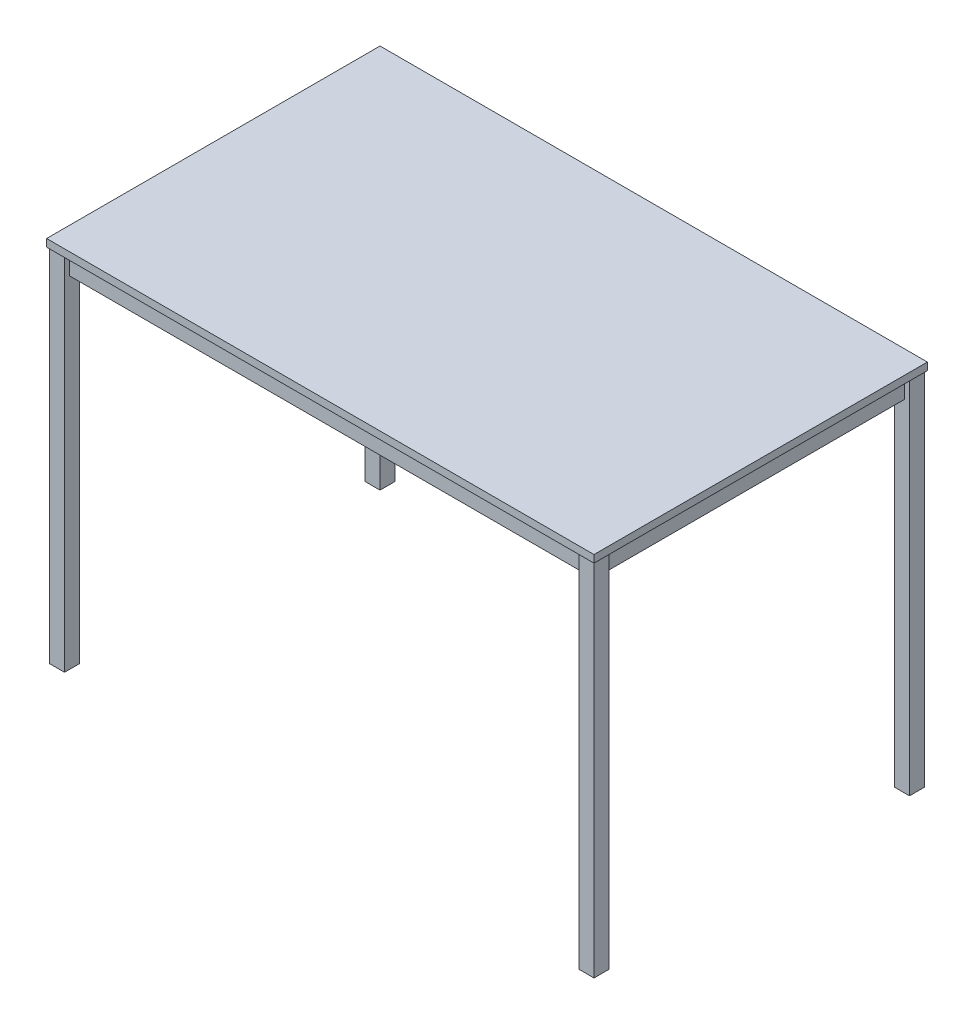
ISO-10303-21;
HEADER;
FILE_DESCRIPTION(('STEP AP214'),'2;1');
FILE_NAME('part.step','',(''),(''),'','','');
FILE_SCHEMA(('AUTOMOTIVE_DESIGN { 1 0 10303 214 1 1 1 1 }'));
ENDSEC;
DATA;
#1=APPLICATION_CONTEXT('core data for automotive mechanical design processes');
#2=APPLICATION_PROTOCOL_DEFINITION('international standard','automotive_design',2000,#1);
#3=PRODUCT_CONTEXT('',#1,'mechanical');
#4=PRODUCT('Part','Part','',(#3));
#5=PRODUCT_RELATED_PRODUCT_CATEGORY('part','',(#4));
#6=PRODUCT_DEFINITION_FORMATION('','',#4);
#7=PRODUCT_DEFINITION_CONTEXT('part definition',#1,'design');
#8=PRODUCT_DEFINITION('design','',#6,#7);
#9=PRODUCT_DEFINITION_SHAPE('','',#8);
#10=(LENGTH_UNIT() NAMED_UNIT(*) SI_UNIT(.MILLI.,.METRE.));
#11=(NAMED_UNIT(*) PLANE_ANGLE_UNIT() SI_UNIT($,.RADIAN.));
#12=(NAMED_UNIT(*) SI_UNIT($,.STERADIAN.) SOLID_ANGLE_UNIT());
#13=UNCERTAINTY_MEASURE_WITH_UNIT(LENGTH_MEASURE(1.E-05),#10,'distance_accuracy_value','');
#14=(GEOMETRIC_REPRESENTATION_CONTEXT(3) GLOBAL_UNCERTAINTY_ASSIGNED_CONTEXT((#13)) GLOBAL_UNIT_ASSIGNED_CONTEXT((#10,
#11,#12)) REPRESENTATION_CONTEXT('',''));
#15=CARTESIAN_POINT('',(0.,0.,0.));
#16=DIRECTION('',(0.,0.,1.));
#17=DIRECTION('',(1.,0.,0.));
#18=AXIS2_PLACEMENT_3D('',#15,#16,#17);
#19=CARTESIAN_POINT('',(-550.,0.,335.));
#20=DIRECTION('',(0.,1.,0.));
#21=DIRECTION('',(0.,0.,1.));
#22=AXIS2_PLACEMENT_3D('',#19,#20,#21);
#23=PLANE('',#22);
#24=DIRECTION('',(0.,0.,-1.));
#25=VECTOR('',#24,1.);
#26=CARTESIAN_POINT('',(-517.,0.,332.));
#27=LINE('',#26,#25);
#28=CARTESIAN_POINT('',(-517.,0.,302.));
#29=VERTEX_POINT('',#28);
#30=CARTESIAN_POINT('',(-517.,0.,-302.));
#31=VERTEX_POINT('',#30);
#32=EDGE_CURVE('E380',#29,#31,#27,.T.);
#33=ORIENTED_EDGE('',*,*,#32,.T.);
#34=DIRECTION('',(-1.,0.,0.));
#35=VECTOR('',#34,1.);
#36=CARTESIAN_POINT('',(500000.,0.,-301.999999998148));
#37=LINE('',#36,#35);
#38=CARTESIAN_POINT('',(516.999999999996,0.,-301.999999999996));
#39=VERTEX_POINT('',#38);
#40=EDGE_CURVE('E754',#39,#31,#37,.T.);
#41=ORIENTED_EDGE('',*,*,#40,.F.);
#42=DIRECTION('',(0.,0.,-1.));
#43=VECTOR('',#42,1.);
#44=CARTESIAN_POINT('',(517.,0.,332.));
#45=LINE('',#44,#43);
#46=CARTESIAN_POINT('',(517.,0.,301.999999999996));
#47=VERTEX_POINT('',#46);
#48=EDGE_CURVE('E256',#47,#39,#45,.T.);
#49=ORIENTED_EDGE('',*,*,#48,.F.);
#50=DIRECTION('',(-1.,0.,0.));
#51=VECTOR('',#50,1.);
#52=CARTESIAN_POINT('',(500000.,0.,301.999999998148));
#53=LINE('',#52,#51);
#54=EDGE_CURVE('E767',#47,#29,#53,.T.);
#55=ORIENTED_EDGE('',*,*,#54,.T.);
#56=EDGE_LOOP('',(#33,#41,#49,#55));
#57=FACE_BOUND('',#56,.T.);
#58=ADVANCED_FACE('F33',(#57),#23,.F.);
#59=CARTESIAN_POINT('',(-517.,-725.,332.));
#60=DIRECTION('',(1.,0.,0.));
#61=DIRECTION('',(0.,0.,-1.));
#62=AXIS2_PLACEMENT_3D('',#59,#60,#61);
#63=PLANE('',#62);
#64=DIRECTION('',(0.,1.,0.));
#65=VECTOR('',#64,1.);
#66=CARTESIAN_POINT('',(-517.,-39.9999999999999,-302.));
#67=LINE('',#66,#65);
#68=CARTESIAN_POINT('',(-517.,-39.9999999999999,-302.));
#69=VERTEX_POINT('',#68);
#70=EDGE_CURVE('E245',#69,#31,#67,.T.);
#71=ORIENTED_EDGE('',*,*,#70,.T.);
#72=ORIENTED_EDGE('',*,*,#32,.F.);
#73=DIRECTION('',(0.,1.,0.));
#74=VECTOR('',#73,1.);
#75=CARTESIAN_POINT('',(-517.,-39.9999999999999,302.));
#76=LINE('',#75,#74);
#77=CARTESIAN_POINT('',(-517.,-39.9999999999999,302.));
#78=VERTEX_POINT('',#77);
#79=EDGE_CURVE('E278',#78,#29,#76,.T.);
#80=ORIENTED_EDGE('',*,*,#79,.F.);
#81=DIRECTION('',(0.,0.,-1.));
#82=VECTOR('',#81,1.);
#83=CARTESIAN_POINT('',(-517.,-40.,500000.));
#84=LINE('',#83,#82);
#85=EDGE_CURVE('E706',#78,#69,#84,.T.);
#86=ORIENTED_EDGE('',*,*,#85,.T.);
#87=EDGE_LOOP('',(#71,#72,#80,#86));
#88=FACE_BOUND('',#87,.T.);
#89=ADVANCED_FACE('F445',(#88),#63,.T.);
#90=CARTESIAN_POINT('',(517.,-725.,332.));
#91=DIRECTION('',(1.,0.,0.));
#92=DIRECTION('',(0.,0.,-1.));
#93=AXIS2_PLACEMENT_3D('',#90,#91,#92);
#94=PLANE('',#93);
#95=ORIENTED_EDGE('',*,*,#48,.T.);
#96=DIRECTION('',(0.,1.,0.));
#97=VECTOR('',#96,1.);
#98=CARTESIAN_POINT('',(516.999999999996,-39.9999999999999,-301.999999999996));
#99=LINE('',#98,#97);
#100=CARTESIAN_POINT('',(516.999999999996,-39.9999999999999,-301.999999999996));
#101=VERTEX_POINT('',#100);
#102=EDGE_CURVE('E238',#101,#39,#99,.T.);
#103=ORIENTED_EDGE('',*,*,#102,.F.);
#104=DIRECTION('',(0.,0.,-1.));
#105=VECTOR('',#104,1.);
#106=CARTESIAN_POINT('',(517.,-40.,500000.));
#107=LINE('',#106,#105);
#108=CARTESIAN_POINT('',(517.,-40.,302.000000000021));
#109=VERTEX_POINT('',#108);
#110=EDGE_CURVE('E253',#109,#101,#107,.T.);
#111=ORIENTED_EDGE('',*,*,#110,.F.);
#112=DIRECTION('',(0.,1.,0.));
#113=VECTOR('',#112,1.);
#114=CARTESIAN_POINT('',(516.999999999996,-39.9999999999999,301.999999999996));
#115=LINE('',#114,#113);
#116=EDGE_CURVE('E770',#109,#47,#115,.T.);
#117=ORIENTED_EDGE('',*,*,#116,.T.);
#118=EDGE_LOOP('',(#95,#103,#111,#117));
#119=FACE_BOUND('',#118,.T.);
#120=ADVANCED_FACE('F252',(#119),#94,.F.);
#121=DIRECTION('',(0.,0.,1.));
#122=VECTOR('',#121,1.);
#123=CARTESIAN_POINT('',(-550.,0.,-335.));
#124=LINE('',#123,#122);
#125=CARTESIAN_POINT('',(-550.,0.,-335.));
#126=VERTEX_POINT('',#125);
#127=CARTESIAN_POINT('',(-550.,0.,335.));
#128=VERTEX_POINT('',#127);
#129=EDGE_CURVE('E385',#126,#128,#124,.T.);
#130=ORIENTED_EDGE('',*,*,#129,.F.);
#131=DIRECTION('',(-1.,0.,0.));
#132=VECTOR('',#131,1.);
#133=CARTESIAN_POINT('',(-550.,0.,-335.));
#134=LINE('',#133,#132);
#135=CARTESIAN_POINT('',(550.,0.,-335.));
#136=VERTEX_POINT('',#135);
#137=EDGE_CURVE('E396',#136,#126,#134,.T.);
#138=ORIENTED_EDGE('',*,*,#137,.F.);
#139=DIRECTION('',(0.,0.,-1.));
#140=VECTOR('',#139,1.);
#141=CARTESIAN_POINT('',(550.,0.,-335.));
#142=LINE('',#141,#140);
#143=CARTESIAN_POINT('',(550.,0.,335.));
#144=VERTEX_POINT('',#143);
#145=EDGE_CURVE('E407',#144,#136,#142,.T.);
#146=ORIENTED_EDGE('',*,*,#145,.F.);
#147=DIRECTION('',(1.,0.,0.));
#148=VECTOR('',#147,1.);
#149=CARTESIAN_POINT('',(-550.,0.,335.));
#150=LINE('',#149,#148);
#151=EDGE_CURVE('E405',#128,#144,#150,.T.);
#152=ORIENTED_EDGE('',*,*,#151,.F.);
#153=EDGE_LOOP('',(#130,#138,#146,#152));
#154=FACE_BOUND('',#153,.T.);
#155=CARTESIAN_POINT('',(516.999999999996,0.,-321.999999999996));
#156=VERTEX_POINT('',#155);
#157=CARTESIAN_POINT('',(517.,0.,-332.));
#158=VERTEX_POINT('',#157);
#159=EDGE_CURVE('E312',#156,#158,#45,.T.);
#160=ORIENTED_EDGE('',*,*,#159,.F.);
#161=DIRECTION('',(-1.,0.,0.));
#162=VECTOR('',#161,1.);
#163=CARTESIAN_POINT('',(500000.,0.,-321.999999998148));
#164=LINE('',#163,#162);
#165=CARTESIAN_POINT('',(-517.,0.,-322.));
#166=VERTEX_POINT('',#165);
#167=EDGE_CURVE('E744',#156,#166,#164,.T.);
#168=ORIENTED_EDGE('',*,*,#167,.T.);
#169=CARTESIAN_POINT('',(-517.,0.,-332.));
#170=VERTEX_POINT('',#169);
#171=EDGE_CURVE('E376',#166,#170,#27,.T.);
#172=ORIENTED_EDGE('',*,*,#171,.T.);
#173=DIRECTION('',(1.,0.,0.));
#174=VECTOR('',#173,1.);
#175=CARTESIAN_POINT('',(-547.,0.,-332.));
#176=LINE('',#175,#174);
#177=CARTESIAN_POINT('',(-547.,0.,-332.));
#178=VERTEX_POINT('',#177);
#179=EDGE_CURVE('E332',#178,#170,#176,.T.);
#180=ORIENTED_EDGE('',*,*,#179,.F.);
#181=DIRECTION('',(0.,0.,-1.));
#182=VECTOR('',#181,1.);
#183=CARTESIAN_POINT('',(-547.,0.,-332.));
#184=LINE('',#183,#182);
#185=CARTESIAN_POINT('',(-547.,0.,-302.));
#186=VERTEX_POINT('',#185);
#187=EDGE_CURVE('E320',#186,#178,#184,.T.);
#188=ORIENTED_EDGE('',*,*,#187,.F.);
#189=DIRECTION('',(-1.,0.,0.));
#190=VECTOR('',#189,1.);
#191=CARTESIAN_POINT('',(-547.,0.,-302.));
#192=LINE('',#191,#190);
#193=CARTESIAN_POINT('',(-537.,0.,-302.));
#194=VERTEX_POINT('',#193);
#195=EDGE_CURVE('E341',#194,#186,#192,.T.);
#196=ORIENTED_EDGE('',*,*,#195,.F.);
#197=DIRECTION('',(0.,0.,-1.));
#198=VECTOR('',#197,1.);
#199=CARTESIAN_POINT('',(-537.,0.,500000.));
#200=LINE('',#199,#198);
#201=CARTESIAN_POINT('',(-537.,0.,302.));
#202=VERTEX_POINT('',#201);
#203=EDGE_CURVE('E713',#202,#194,#200,.T.);
#204=ORIENTED_EDGE('',*,*,#203,.F.);
#205=DIRECTION('',(-1.,0.,0.));
#206=VECTOR('',#205,1.);
#207=CARTESIAN_POINT('',(-547.,0.,302.));
#208=LINE('',#207,#206);
#209=CARTESIAN_POINT('',(-547.,0.,302.));
#210=VERTEX_POINT('',#209);
#211=EDGE_CURVE('E361',#202,#210,#208,.T.);
#212=ORIENTED_EDGE('',*,*,#211,.T.);
#213=DIRECTION('',(0.,0.,1.));
#214=VECTOR('',#213,1.);
#215=CARTESIAN_POINT('',(-547.,0.,332.));
#216=LINE('',#215,#214);
#217=CARTESIAN_POINT('',(-547.,0.,332.));
#218=VERTEX_POINT('',#217);
#219=EDGE_CURVE('E348',#210,#218,#216,.T.);
#220=ORIENTED_EDGE('',*,*,#219,.T.);
#221=DIRECTION('',(1.,0.,0.));
#222=VECTOR('',#221,1.);
#223=CARTESIAN_POINT('',(-547.,0.,332.));
#224=LINE('',#223,#222);
#225=CARTESIAN_POINT('',(-517.,0.,332.));
#226=VERTEX_POINT('',#225);
#227=EDGE_CURVE('E373',#218,#226,#224,.T.);
#228=ORIENTED_EDGE('',*,*,#227,.T.);
#229=CARTESIAN_POINT('',(-517.,0.,322.));
#230=VERTEX_POINT('',#229);
#231=EDGE_CURVE('E377',#226,#230,#27,.T.);
#232=ORIENTED_EDGE('',*,*,#231,.T.);
#233=DIRECTION('',(-1.,0.,0.));
#234=VECTOR('',#233,1.);
#235=CARTESIAN_POINT('',(500000.,0.,321.999999998148));
#236=LINE('',#235,#234);
#237=CARTESIAN_POINT('',(516.999999999996,0.,321.999999999996));
#238=VERTEX_POINT('',#237);
#239=EDGE_CURVE('E769',#238,#230,#236,.T.);
#240=ORIENTED_EDGE('',*,*,#239,.F.);
#241=CARTESIAN_POINT('',(517.,0.,332.));
#242=VERTEX_POINT('',#241);
#243=EDGE_CURVE('E313',#242,#238,#45,.T.);
#244=ORIENTED_EDGE('',*,*,#243,.F.);
#245=DIRECTION('',(-1.,0.,0.));
#246=VECTOR('',#245,1.);
#247=CARTESIAN_POINT('',(547.,0.,332.));
#248=LINE('',#247,#246);
#249=CARTESIAN_POINT('',(547.,0.,332.));
#250=VERTEX_POINT('',#249);
#251=EDGE_CURVE('E301',#250,#242,#248,.T.);
#252=ORIENTED_EDGE('',*,*,#251,.F.);
#253=DIRECTION('',(0.,0.,1.));
#254=VECTOR('',#253,1.);
#255=CARTESIAN_POINT('',(547.,0.,332.));
#256=LINE('',#255,#254);
#257=CARTESIAN_POINT('',(547.,0.,302.));
#258=VERTEX_POINT('',#257);
#259=EDGE_CURVE('E288',#258,#250,#256,.T.);
#260=ORIENTED_EDGE('',*,*,#259,.F.);
#261=DIRECTION('',(1.,0.,0.));
#262=VECTOR('',#261,1.);
#263=CARTESIAN_POINT('',(547.,0.,302.));
#264=LINE('',#263,#262);
#265=CARTESIAN_POINT('',(537.,0.,302.000000000021));
#266=VERTEX_POINT('',#265);
#267=EDGE_CURVE('E310',#266,#258,#264,.T.);
#268=ORIENTED_EDGE('',*,*,#267,.F.);
#269=DIRECTION('',(0.,0.,-1.));
#270=VECTOR('',#269,1.);
#271=CARTESIAN_POINT('',(537.,0.,500000.));
#272=LINE('',#271,#270);
#273=CARTESIAN_POINT('',(537.,0.,-302.));
#274=VERTEX_POINT('',#273);
#275=EDGE_CURVE('E739',#266,#274,#272,.T.);
#276=ORIENTED_EDGE('',*,*,#275,.T.);
#277=DIRECTION('',(1.,0.,0.));
#278=VECTOR('',#277,1.);
#279=CARTESIAN_POINT('',(547.,0.,-302.));
#280=LINE('',#279,#278);
#281=CARTESIAN_POINT('',(547.,0.,-302.));
#282=VERTEX_POINT('',#281);
#283=EDGE_CURVE('E727',#274,#282,#280,.T.);
#284=ORIENTED_EDGE('',*,*,#283,.T.);
#285=DIRECTION('',(0.,0.,-1.));
#286=VECTOR('',#285,1.);
#287=CARTESIAN_POINT('',(547.,0.,-332.));
#288=LINE('',#287,#286);
#289=CARTESIAN_POINT('',(547.,0.,-332.));
#290=VERTEX_POINT('',#289);
#291=EDGE_CURVE('E722',#282,#290,#288,.T.);
#292=ORIENTED_EDGE('',*,*,#291,.T.);
#293=DIRECTION('',(-1.,0.,0.));
#294=VECTOR('',#293,1.);
#295=CARTESIAN_POINT('',(547.,0.,-332.));
#296=LINE('',#295,#294);
#297=EDGE_CURVE('E734',#290,#158,#296,.T.);
#298=ORIENTED_EDGE('',*,*,#297,.T.);
#299=EDGE_LOOP('',(#160,#168,#172,#180,#188,#196,#204,#212,#220,#228,#232,#240,#244,#252,#260,
#268,#276,#284,#292,#298));
#300=FACE_BOUND('',#299,.T.);
#301=ADVANCED_FACE('F425',(#154,#300),#23,.F.);
#302=DIRECTION('',(0.,-1.,0.));
#303=VECTOR('',#302,1.);
#304=CARTESIAN_POINT('',(-517.,-39.9999999999999,-322.));
#305=LINE('',#304,#303);
#306=CARTESIAN_POINT('',(-517.,-39.9999999999999,-322.));
#307=VERTEX_POINT('',#306);
#308=EDGE_CURVE('E749',#166,#307,#305,.T.);
#309=ORIENTED_EDGE('',*,*,#308,.T.);
#310=DIRECTION('',(0.,0.,1.));
#311=VECTOR('',#310,1.);
#312=CARTESIAN_POINT('',(-517.,-39.9999999999999,-302.));
#313=LINE('',#312,#311);
#314=EDGE_CURVE('E752',#307,#69,#313,.T.);
#315=ORIENTED_EDGE('',*,*,#314,.T.);
#316=DIRECTION('',(0.,1.,0.));
#317=VECTOR('',#316,1.);
#318=CARTESIAN_POINT('',(-517.,-725.,-302.));
#319=LINE('',#318,#317);
#320=CARTESIAN_POINT('',(-517.,-725.,-302.));
#321=VERTEX_POINT('',#320);
#322=EDGE_CURVE('E352',#321,#69,#319,.T.);
#323=ORIENTED_EDGE('',*,*,#322,.F.);
#324=DIRECTION('',(0.,0.,1.));
#325=VECTOR('',#324,1.);
#326=CARTESIAN_POINT('',(-517.,-725.,-332.));
#327=LINE('',#326,#325);
#328=CARTESIAN_POINT('',(-517.,-725.,-332.));
#329=VERTEX_POINT('',#328);
#330=EDGE_CURVE('E334',#329,#321,#327,.T.);
#331=ORIENTED_EDGE('',*,*,#330,.F.);
#332=DIRECTION('',(0.,1.,0.));
#333=VECTOR('',#332,1.);
#334=CARTESIAN_POINT('',(-517.,-725.,-332.));
#335=LINE('',#334,#333);
#336=EDGE_CURVE('E349',#329,#170,#335,.T.);
#337=ORIENTED_EDGE('',*,*,#336,.T.);
#338=ORIENTED_EDGE('',*,*,#171,.F.);
#339=EDGE_LOOP('',(#309,#315,#323,#331,#337,#338));
#340=FACE_BOUND('',#339,.T.);
#341=ADVANCED_FACE('F454',(#340),#63,.T.);
#342=DIRECTION('',(0.,1.,0.));
#343=VECTOR('',#342,1.);
#344=CARTESIAN_POINT('',(-517.,-725.,302.));
#345=LINE('',#344,#343);
#346=CARTESIAN_POINT('',(-517.,-725.,302.));
#347=VERTEX_POINT('',#346);
#348=EDGE_CURVE('E386',#347,#78,#345,.T.);
#349=ORIENTED_EDGE('',*,*,#348,.T.);
#350=DIRECTION('',(0.,0.,-1.));
#351=VECTOR('',#350,1.);
#352=CARTESIAN_POINT('',(-517.,-39.9999999999999,302.));
#353=LINE('',#352,#351);
#354=CARTESIAN_POINT('',(-517.,-39.9999999999999,322.));
#355=VERTEX_POINT('',#354);
#356=EDGE_CURVE('E56',#355,#78,#353,.T.);
#357=ORIENTED_EDGE('',*,*,#356,.F.);
#358=DIRECTION('',(0.,-1.,0.));
#359=VECTOR('',#358,1.);
#360=CARTESIAN_POINT('',(-517.,-39.9999999999999,322.));
#361=LINE('',#360,#359);
#362=EDGE_CURVE('E760',#230,#355,#361,.T.);
#363=ORIENTED_EDGE('',*,*,#362,.F.);
#364=ORIENTED_EDGE('',*,*,#231,.F.);
#365=DIRECTION('',(0.,1.,0.));
#366=VECTOR('',#365,1.);
#367=CARTESIAN_POINT('',(-517.,-725.,332.));
#368=LINE('',#367,#366);
#369=CARTESIAN_POINT('',(-517.,-725.,332.));
#370=VERTEX_POINT('',#369);
#371=EDGE_CURVE('E388',#370,#226,#368,.T.);
#372=ORIENTED_EDGE('',*,*,#371,.F.);
#373=DIRECTION('',(0.,0.,-1.));
#374=VECTOR('',#373,1.);
#375=CARTESIAN_POINT('',(-517.,-725.,332.));
#376=LINE('',#375,#374);
#377=EDGE_CURVE('E364',#370,#347,#376,.T.);
#378=ORIENTED_EDGE('',*,*,#377,.T.);
#379=EDGE_LOOP('',(#349,#357,#363,#364,#372,#378));
#380=FACE_BOUND('',#379,.T.);
#381=ADVANCED_FACE('F453',(#380),#63,.T.);
#382=DIRECTION('',(0.,0.,1.));
#383=VECTOR('',#382,1.);
#384=CARTESIAN_POINT('',(516.999999999996,-39.9999999999999,-301.999999999996));
#385=LINE('',#384,#383);
#386=CARTESIAN_POINT('',(517.000000000003,-39.9999999999999,-322.));
#387=VERTEX_POINT('',#386);
#388=EDGE_CURVE('E229',#387,#101,#385,.T.);
#389=ORIENTED_EDGE('',*,*,#388,.F.);
#390=DIRECTION('',(0.,-1.,0.));
#391=VECTOR('',#390,1.);
#392=CARTESIAN_POINT('',(516.999999999996,-39.9999999999999,-321.999999999996));
#393=LINE('',#392,#391);
#394=EDGE_CURVE('E237',#156,#387,#393,.T.);
#395=ORIENTED_EDGE('',*,*,#394,.F.);
#396=ORIENTED_EDGE('',*,*,#159,.T.);
#397=DIRECTION('',(0.,1.,0.));
#398=VECTOR('',#397,1.);
#399=CARTESIAN_POINT('',(517.,-725.,-332.));
#400=LINE('',#399,#398);
#401=CARTESIAN_POINT('',(517.,-725.,-332.));
#402=VERTEX_POINT('',#401);
#403=EDGE_CURVE('E285',#402,#158,#400,.T.);
#404=ORIENTED_EDGE('',*,*,#403,.F.);
#405=DIRECTION('',(0.,0.,1.));
#406=VECTOR('',#405,1.);
#407=CARTESIAN_POINT('',(517.,-725.,-332.));
#408=LINE('',#407,#406);
#409=CARTESIAN_POINT('',(517.,-725.,-302.));
#410=VERTEX_POINT('',#409);
#411=EDGE_CURVE('E282',#402,#410,#408,.T.);
#412=ORIENTED_EDGE('',*,*,#411,.T.);
#413=DIRECTION('',(0.,1.,0.));
#414=VECTOR('',#413,1.);
#415=CARTESIAN_POINT('',(517.,-725.,-302.));
#416=LINE('',#415,#414);
#417=EDGE_CURVE('E274',#410,#101,#416,.T.);
#418=ORIENTED_EDGE('',*,*,#417,.T.);
#419=EDGE_LOOP('',(#389,#395,#396,#404,#412,#418));
#420=FACE_BOUND('',#419,.T.);
#421=ADVANCED_FACE('F280',(#420),#94,.F.);
#422=DIRECTION('',(0.,0.,-1.));
#423=VECTOR('',#422,1.);
#424=CARTESIAN_POINT('',(516.999999999996,-39.9999999999999,301.999999996299));
#425=LINE('',#424,#423);
#426=CARTESIAN_POINT('',(517.,-39.9999999999999,321.999999999996));
#427=VERTEX_POINT('',#426);
#428=EDGE_CURVE('E755',#427,#109,#425,.T.);
#429=ORIENTED_EDGE('',*,*,#428,.T.);
#430=DIRECTION('',(0.,1.,0.));
#431=VECTOR('',#430,1.);
#432=CARTESIAN_POINT('',(517.,-725.,302.));
#433=LINE('',#432,#431);
#434=CARTESIAN_POINT('',(517.,-725.,302.));
#435=VERTEX_POINT('',#434);
#436=EDGE_CURVE('E324',#435,#109,#433,.T.);
#437=ORIENTED_EDGE('',*,*,#436,.F.);
#438=DIRECTION('',(0.,0.,-1.));
#439=VECTOR('',#438,1.);
#440=CARTESIAN_POINT('',(517.,-725.,332.));
#441=LINE('',#440,#439);
#442=CARTESIAN_POINT('',(517.,-725.,332.));
#443=VERTEX_POINT('',#442);
#444=EDGE_CURVE('E303',#443,#435,#441,.T.);
#445=ORIENTED_EDGE('',*,*,#444,.F.);
#446=DIRECTION('',(0.,1.,0.));
#447=VECTOR('',#446,1.);
#448=CARTESIAN_POINT('',(517.,-725.,332.));
#449=LINE('',#448,#447);
#450=EDGE_CURVE('E321',#443,#242,#449,.T.);
#451=ORIENTED_EDGE('',*,*,#450,.T.);
#452=ORIENTED_EDGE('',*,*,#243,.T.);
#453=DIRECTION('',(0.,-1.,0.));
#454=VECTOR('',#453,1.);
#455=CARTESIAN_POINT('',(516.999999999996,-39.9999999999999,321.999999999996));
#456=LINE('',#455,#454);
#457=EDGE_CURVE('E778',#238,#427,#456,.T.);
#458=ORIENTED_EDGE('',*,*,#457,.T.);
#459=EDGE_LOOP('',(#429,#437,#445,#451,#452,#458));
#460=FACE_BOUND('',#459,.T.);
#461=ADVANCED_FACE('F465',(#460),#94,.F.);
#462=CARTESIAN_POINT('',(-547.,-725.,302.));
#463=DIRECTION('',(0.,0.,-1.));
#464=DIRECTION('',(-1.,0.,0.));
#465=AXIS2_PLACEMENT_3D('',#462,#463,#464);
#466=PLANE('',#465);
#467=DIRECTION('',(0.,1.,0.));
#468=VECTOR('',#467,1.);
#469=CARTESIAN_POINT('',(-537.,0.,302.000000000021));
#470=LINE('',#469,#468);
#471=CARTESIAN_POINT('',(-537.,-39.9999999999999,302.));
#472=VERTEX_POINT('',#471);
#473=EDGE_CURVE('E719',#472,#202,#470,.T.);
#474=ORIENTED_EDGE('',*,*,#473,.F.);
#475=DIRECTION('',(-1.,0.,0.));
#476=VECTOR('',#475,1.);
#477=CARTESIAN_POINT('',(-517.,-40.,302.000000000021));
#478=LINE('',#477,#476);
#479=EDGE_CURVE('E716',#78,#472,#478,.T.);
#480=ORIENTED_EDGE('',*,*,#479,.F.);
#481=ORIENTED_EDGE('',*,*,#348,.F.);
#482=DIRECTION('',(-1.,0.,0.));
#483=VECTOR('',#482,1.);
#484=CARTESIAN_POINT('',(-547.,-725.,302.));
#485=LINE('',#484,#483);
#486=CARTESIAN_POINT('',(-547.,-725.,302.));
#487=VERTEX_POINT('',#486);
#488=EDGE_CURVE('E367',#347,#487,#485,.T.);
#489=ORIENTED_EDGE('',*,*,#488,.T.);
#490=DIRECTION('',(0.,1.,0.));
#491=VECTOR('',#490,1.);
#492=CARTESIAN_POINT('',(-547.,-725.,302.));
#493=LINE('',#492,#491);
#494=EDGE_CURVE('E382',#487,#210,#493,.T.);
#495=ORIENTED_EDGE('',*,*,#494,.T.);
#496=ORIENTED_EDGE('',*,*,#211,.F.);
#497=EDGE_LOOP('',(#474,#480,#481,#489,#495,#496));
#498=FACE_BOUND('',#497,.T.);
#499=ADVANCED_FACE('F471',(#498),#466,.T.);
#500=CARTESIAN_POINT('',(-547.,-725.,-302.));
#501=DIRECTION('',(0.,0.,-1.));
#502=DIRECTION('',(-1.,0.,0.));
#503=AXIS2_PLACEMENT_3D('',#500,#501,#502);
#504=PLANE('',#503);
#505=DIRECTION('',(1.,0.,0.));
#506=VECTOR('',#505,1.);
#507=CARTESIAN_POINT('',(-517.,-40.,-302.));
#508=LINE('',#507,#506);
#509=CARTESIAN_POINT('',(-537.,-40.,-302.));
#510=VERTEX_POINT('',#509);
#511=EDGE_CURVE('E697',#510,#69,#508,.T.);
#512=ORIENTED_EDGE('',*,*,#511,.F.);
#513=DIRECTION('',(0.,-1.,0.));
#514=VECTOR('',#513,1.);
#515=CARTESIAN_POINT('',(-537.,0.,-302.));
#516=LINE('',#515,#514);
#517=EDGE_CURVE('E700',#194,#510,#516,.T.);
#518=ORIENTED_EDGE('',*,*,#517,.F.);
#519=ORIENTED_EDGE('',*,*,#195,.T.);
#520=DIRECTION('',(0.,1.,0.));
#521=VECTOR('',#520,1.);
#522=CARTESIAN_POINT('',(-547.,-725.,-302.));
#523=LINE('',#522,#521);
#524=CARTESIAN_POINT('',(-547.,-725.,-302.));
#525=VERTEX_POINT('',#524);
#526=EDGE_CURVE('E338',#525,#186,#523,.T.);
#527=ORIENTED_EDGE('',*,*,#526,.F.);
#528=DIRECTION('',(-1.,0.,0.));
#529=VECTOR('',#528,1.);
#530=CARTESIAN_POINT('',(-547.,-725.,-302.));
#531=LINE('',#530,#529);
#532=EDGE_CURVE('E331',#321,#525,#531,.T.);
#533=ORIENTED_EDGE('',*,*,#532,.F.);
#534=ORIENTED_EDGE('',*,*,#322,.T.);
#535=EDGE_LOOP('',(#512,#518,#519,#527,#533,#534));
#536=FACE_BOUND('',#535,.T.);
#537=ADVANCED_FACE('F443',(#536),#504,.F.);
#538=CARTESIAN_POINT('',(-550.,15.,-335.));
#539=DIRECTION('',(1.,0.,0.));
#540=DIRECTION('',(0.,0.,-1.));
#541=AXIS2_PLACEMENT_3D('',#538,#539,#540);
#542=PLANE('',#541);
#543=ORIENTED_EDGE('',*,*,#129,.T.);
#544=DIRECTION('',(0.,-1.,0.));
#545=VECTOR('',#544,1.);
#546=CARTESIAN_POINT('',(-550.,15.,335.));
#547=LINE('',#546,#545);
#548=CARTESIAN_POINT('',(-550.,15.,335.));
#549=VERTEX_POINT('',#548);
#550=EDGE_CURVE('E11',#549,#128,#547,.T.);
#551=ORIENTED_EDGE('',*,*,#550,.F.);
#552=DIRECTION('',(0.,0.,1.));
#553=VECTOR('',#552,1.);
#554=CARTESIAN_POINT('',(-550.,15.,-335.));
#555=LINE('',#554,#553);
#556=CARTESIAN_POINT('',(-550.,15.,-335.));
#557=VERTEX_POINT('',#556);
#558=EDGE_CURVE('E392',#557,#549,#555,.T.);
#559=ORIENTED_EDGE('',*,*,#558,.F.);
#560=DIRECTION('',(0.,-1.,0.));
#561=VECTOR('',#560,1.);
#562=CARTESIAN_POINT('',(-550.,15.,-335.));
#563=LINE('',#562,#561);
#564=EDGE_CURVE('E402',#557,#126,#563,.T.);
#565=ORIENTED_EDGE('',*,*,#564,.T.);
#566=EDGE_LOOP('',(#543,#551,#559,#565));
#567=FACE_BOUND('',#566,.T.);
#568=ADVANCED_FACE('F35',(#567),#542,.F.);
#569=CARTESIAN_POINT('',(-550.,15.,335.));
#570=DIRECTION('',(0.,0.,-1.));
#571=DIRECTION('',(-1.,0.,0.));
#572=AXIS2_PLACEMENT_3D('',#569,#570,#571);
#573=PLANE('',#572);
#574=ORIENTED_EDGE('',*,*,#151,.T.);
#575=DIRECTION('',(0.,-1.,0.));
#576=VECTOR('',#575,1.);
#577=CARTESIAN_POINT('',(550.,15.,335.));
#578=LINE('',#577,#576);
#579=CARTESIAN_POINT('',(550.,15.,335.));
#580=VERTEX_POINT('',#579);
#581=EDGE_CURVE('E41',#580,#144,#578,.T.);
#582=ORIENTED_EDGE('',*,*,#581,.F.);
#583=DIRECTION('',(1.,0.,0.));
#584=VECTOR('',#583,1.);
#585=CARTESIAN_POINT('',(-550.,15.,335.));
#586=LINE('',#585,#584);
#587=EDGE_CURVE('E395',#549,#580,#586,.T.);
#588=ORIENTED_EDGE('',*,*,#587,.F.);
#589=ORIENTED_EDGE('',*,*,#550,.T.);
#590=EDGE_LOOP('',(#574,#582,#588,#589));
#591=FACE_BOUND('',#590,.T.);
#592=ADVANCED_FACE('F436',(#591),#573,.F.);
#593=CARTESIAN_POINT('',(550.,15.,-335.));
#594=DIRECTION('',(-1.,0.,0.));
#595=DIRECTION('',(0.,0.,1.));
#596=AXIS2_PLACEMENT_3D('',#593,#594,#595);
#597=PLANE('',#596);
#598=ORIENTED_EDGE('',*,*,#145,.T.);
#599=DIRECTION('',(0.,-1.,0.));
#600=VECTOR('',#599,1.);
#601=CARTESIAN_POINT('',(550.,15.,-335.));
#602=LINE('',#601,#600);
#603=CARTESIAN_POINT('',(550.,15.,-335.));
#604=VERTEX_POINT('',#603);
#605=EDGE_CURVE('E412',#604,#136,#602,.T.);
#606=ORIENTED_EDGE('',*,*,#605,.F.);
#607=DIRECTION('',(0.,0.,-1.));
#608=VECTOR('',#607,1.);
#609=CARTESIAN_POINT('',(550.,15.,-335.));
#610=LINE('',#609,#608);
#611=EDGE_CURVE('E398',#580,#604,#610,.T.);
#612=ORIENTED_EDGE('',*,*,#611,.F.);
#613=ORIENTED_EDGE('',*,*,#581,.T.);
#614=EDGE_LOOP('',(#598,#606,#612,#613));
#615=FACE_BOUND('',#614,.T.);
#616=ADVANCED_FACE('F419',(#615),#597,.F.);
#617=CARTESIAN_POINT('',(-550.,15.,-335.));
#618=DIRECTION('',(0.,0.,1.));
#619=DIRECTION('',(1.,0.,0.));
#620=AXIS2_PLACEMENT_3D('',#617,#618,#619);
#621=PLANE('',#620);
#622=ORIENTED_EDGE('',*,*,#137,.T.);
#623=ORIENTED_EDGE('',*,*,#564,.F.);
#624=DIRECTION('',(-1.,0.,0.));
#625=VECTOR('',#624,1.);
#626=CARTESIAN_POINT('',(-550.,15.,-335.));
#627=LINE('',#626,#625);
#628=EDGE_CURVE('E400',#604,#557,#627,.T.);
#629=ORIENTED_EDGE('',*,*,#628,.F.);
#630=ORIENTED_EDGE('',*,*,#605,.T.);
#631=EDGE_LOOP('',(#622,#623,#629,#630));
#632=FACE_BOUND('',#631,.T.);
#633=ADVANCED_FACE('F429',(#632),#621,.F.);
#634=CARTESIAN_POINT('',(-550.,15.,335.));
#635=DIRECTION('',(0.,1.,0.));
#636=DIRECTION('',(0.,0.,1.));
#637=AXIS2_PLACEMENT_3D('',#634,#635,#636);
#638=PLANE('',#637);
#639=ORIENTED_EDGE('',*,*,#558,.T.);
#640=ORIENTED_EDGE('',*,*,#587,.T.);
#641=ORIENTED_EDGE('',*,*,#611,.T.);
#642=ORIENTED_EDGE('',*,*,#628,.T.);
#643=EDGE_LOOP('',(#639,#640,#641,#642));
#644=FACE_BOUND('',#643,.T.);
#645=ADVANCED_FACE('F435',(#644),#638,.T.);
#646=CARTESIAN_POINT('',(-547.,-725.,332.));
#647=DIRECTION('',(-1.,0.,0.));
#648=DIRECTION('',(0.,0.,1.));
#649=AXIS2_PLACEMENT_3D('',#646,#647,#648);
#650=PLANE('',#649);
#651=ORIENTED_EDGE('',*,*,#219,.F.);
#652=ORIENTED_EDGE('',*,*,#494,.F.);
#653=DIRECTION('',(0.,0.,1.));
#654=VECTOR('',#653,1.);
#655=CARTESIAN_POINT('',(-547.,-725.,332.));
#656=LINE('',#655,#654);
#657=CARTESIAN_POINT('',(-547.,-725.,332.));
#658=VERTEX_POINT('',#657);
#659=EDGE_CURVE('E357',#487,#658,#656,.T.);
#660=ORIENTED_EDGE('',*,*,#659,.T.);
#661=DIRECTION('',(0.,1.,0.));
#662=VECTOR('',#661,1.);
#663=CARTESIAN_POINT('',(-547.,-725.,332.));
#664=LINE('',#663,#662);
#665=EDGE_CURVE('E370',#658,#218,#664,.T.);
#666=ORIENTED_EDGE('',*,*,#665,.T.);
#667=EDGE_LOOP('',(#651,#652,#660,#666));
#668=FACE_BOUND('',#667,.T.);
#669=ADVANCED_FACE('F486',(#668),#650,.T.);
#670=CARTESIAN_POINT('',(-547.,-725.,332.));
#671=DIRECTION('',(0.,0.,1.));
#672=DIRECTION('',(1.,0.,0.));
#673=AXIS2_PLACEMENT_3D('',#670,#671,#672);
#674=PLANE('',#673);
#675=ORIENTED_EDGE('',*,*,#227,.F.);
#676=ORIENTED_EDGE('',*,*,#665,.F.);
#677=DIRECTION('',(1.,0.,0.));
#678=VECTOR('',#677,1.);
#679=CARTESIAN_POINT('',(-547.,-725.,332.));
#680=LINE('',#679,#678);
#681=EDGE_CURVE('E360',#658,#370,#680,.T.);
#682=ORIENTED_EDGE('',*,*,#681,.T.);
#683=ORIENTED_EDGE('',*,*,#371,.T.);
#684=EDGE_LOOP('',(#675,#676,#682,#683));
#685=FACE_BOUND('',#684,.T.);
#686=ADVANCED_FACE('F482',(#685),#674,.T.);
#687=CARTESIAN_POINT('',(-547.,-725.,302.));
#688=DIRECTION('',(0.,-1.,0.));
#689=DIRECTION('',(0.,0.,-1.));
#690=AXIS2_PLACEMENT_3D('',#687,#688,#689);
#691=PLANE('',#690);
#692=ORIENTED_EDGE('',*,*,#659,.F.);
#693=ORIENTED_EDGE('',*,*,#488,.F.);
#694=ORIENTED_EDGE('',*,*,#377,.F.);
#695=ORIENTED_EDGE('',*,*,#681,.F.);
#696=EDGE_LOOP('',(#692,#693,#694,#695));
#697=FACE_BOUND('',#696,.T.);
#698=ADVANCED_FACE('F485',(#697),#691,.T.);
#699=CARTESIAN_POINT('',(-547.,-725.,-332.));
#700=DIRECTION('',(1.,0.,0.));
#701=DIRECTION('',(0.,0.,-1.));
#702=AXIS2_PLACEMENT_3D('',#699,#700,#701);
#703=PLANE('',#702);
#704=ORIENTED_EDGE('',*,*,#187,.T.);
#705=DIRECTION('',(0.,1.,0.));
#706=VECTOR('',#705,1.);
#707=CARTESIAN_POINT('',(-547.,-725.,-332.));
#708=LINE('',#707,#706);
#709=CARTESIAN_POINT('',(-547.,-725.,-332.));
#710=VERTEX_POINT('',#709);
#711=EDGE_CURVE('E345',#710,#178,#708,.T.);
#712=ORIENTED_EDGE('',*,*,#711,.F.);
#713=DIRECTION('',(0.,0.,-1.));
#714=VECTOR('',#713,1.);
#715=CARTESIAN_POINT('',(-547.,-725.,-332.));
#716=LINE('',#715,#714);
#717=EDGE_CURVE('E328',#525,#710,#716,.T.);
#718=ORIENTED_EDGE('',*,*,#717,.F.);
#719=ORIENTED_EDGE('',*,*,#526,.T.);
#720=EDGE_LOOP('',(#704,#712,#718,#719));
#721=FACE_BOUND('',#720,.T.);
#722=ADVANCED_FACE('F649',(#721),#703,.F.);
#723=CARTESIAN_POINT('',(-547.,-725.,-332.));
#724=DIRECTION('',(0.,0.,1.));
#725=DIRECTION('',(1.,0.,0.));
#726=AXIS2_PLACEMENT_3D('',#723,#724,#725);
#727=PLANE('',#726);
#728=ORIENTED_EDGE('',*,*,#179,.T.);
#729=ORIENTED_EDGE('',*,*,#336,.F.);
#730=DIRECTION('',(1.,0.,0.));
#731=VECTOR('',#730,1.);
#732=CARTESIAN_POINT('',(-547.,-725.,-332.));
#733=LINE('',#732,#731);
#734=EDGE_CURVE('E336',#710,#329,#733,.T.);
#735=ORIENTED_EDGE('',*,*,#734,.F.);
#736=ORIENTED_EDGE('',*,*,#711,.T.);
#737=EDGE_LOOP('',(#728,#729,#735,#736));
#738=FACE_BOUND('',#737,.T.);
#739=ADVANCED_FACE('F639',(#738),#727,.F.);
#740=CARTESIAN_POINT('',(-547.,-725.,-302.));
#741=DIRECTION('',(0.,-1.,0.));
#742=DIRECTION('',(0.,0.,1.));
#743=AXIS2_PLACEMENT_3D('',#740,#741,#742);
#744=PLANE('',#743);
#745=ORIENTED_EDGE('',*,*,#717,.T.);
#746=ORIENTED_EDGE('',*,*,#734,.T.);
#747=ORIENTED_EDGE('',*,*,#330,.T.);
#748=ORIENTED_EDGE('',*,*,#532,.T.);
#749=EDGE_LOOP('',(#745,#746,#747,#748));
#750=FACE_BOUND('',#749,.T.);
#751=ADVANCED_FACE('F629',(#750),#744,.T.);
#752=CARTESIAN_POINT('',(547.,-725.,332.));
#753=DIRECTION('',(-1.,0.,0.));
#754=DIRECTION('',(0.,0.,1.));
#755=AXIS2_PLACEMENT_3D('',#752,#753,#754);
#756=PLANE('',#755);
#757=ORIENTED_EDGE('',*,*,#259,.T.);
#758=DIRECTION('',(0.,1.,0.));
#759=VECTOR('',#758,1.);
#760=CARTESIAN_POINT('',(547.,-725.,332.));
#761=LINE('',#760,#759);
#762=CARTESIAN_POINT('',(547.,-725.,332.));
#763=VERTEX_POINT('',#762);
#764=EDGE_CURVE('E317',#763,#250,#761,.T.);
#765=ORIENTED_EDGE('',*,*,#764,.F.);
#766=DIRECTION('',(0.,0.,1.));
#767=VECTOR('',#766,1.);
#768=CARTESIAN_POINT('',(547.,-725.,332.));
#769=LINE('',#768,#767);
#770=CARTESIAN_POINT('',(547.,-725.,302.));
#771=VERTEX_POINT('',#770);
#772=EDGE_CURVE('E297',#771,#763,#769,.T.);
#773=ORIENTED_EDGE('',*,*,#772,.F.);
#774=DIRECTION('',(0.,1.,0.));
#775=VECTOR('',#774,1.);
#776=CARTESIAN_POINT('',(547.,-725.,302.));
#777=LINE('',#776,#775);
#778=EDGE_CURVE('E307',#771,#258,#777,.T.);
#779=ORIENTED_EDGE('',*,*,#778,.T.);
#780=EDGE_LOOP('',(#757,#765,#773,#779));
#781=FACE_BOUND('',#780,.T.);
#782=ADVANCED_FACE('F620',(#781),#756,.F.);
#783=CARTESIAN_POINT('',(547.,-725.,332.));
#784=DIRECTION('',(0.,0.,-1.));
#785=DIRECTION('',(-1.,0.,0.));
#786=AXIS2_PLACEMENT_3D('',#783,#784,#785);
#787=PLANE('',#786);
#788=ORIENTED_EDGE('',*,*,#251,.T.);
#789=ORIENTED_EDGE('',*,*,#450,.F.);
#790=DIRECTION('',(-1.,0.,0.));
#791=VECTOR('',#790,1.);
#792=CARTESIAN_POINT('',(547.,-725.,332.));
#793=LINE('',#792,#791);
#794=EDGE_CURVE('E305',#763,#443,#793,.T.);
#795=ORIENTED_EDGE('',*,*,#794,.F.);
#796=ORIENTED_EDGE('',*,*,#764,.T.);
#797=EDGE_LOOP('',(#788,#789,#795,#796));
#798=FACE_BOUND('',#797,.T.);
#799=ADVANCED_FACE('F615',(#798),#787,.F.);
#800=CARTESIAN_POINT('',(547.,-725.,302.));
#801=DIRECTION('',(0.,0.,1.));
#802=DIRECTION('',(1.,0.,0.));
#803=AXIS2_PLACEMENT_3D('',#800,#801,#802);
#804=PLANE('',#803);
#805=DIRECTION('',(-1.,0.,0.));
#806=VECTOR('',#805,1.);
#807=CARTESIAN_POINT('',(517.,-40.,302.000000000021));
#808=LINE('',#807,#806);
#809=CARTESIAN_POINT('',(537.,-40.,302.000000000021));
#810=VERTEX_POINT('',#809);
#811=EDGE_CURVE('E267',#810,#109,#808,.T.);
#812=ORIENTED_EDGE('',*,*,#811,.F.);
#813=DIRECTION('',(0.,-1.,0.));
#814=VECTOR('',#813,1.);
#815=CARTESIAN_POINT('',(537.,0.,302.000000000021));
#816=LINE('',#815,#814);
#817=EDGE_CURVE('E268',#266,#810,#816,.T.);
#818=ORIENTED_EDGE('',*,*,#817,.F.);
#819=ORIENTED_EDGE('',*,*,#267,.T.);
#820=ORIENTED_EDGE('',*,*,#778,.F.);
#821=DIRECTION('',(1.,0.,0.));
#822=VECTOR('',#821,1.);
#823=CARTESIAN_POINT('',(547.,-725.,302.));
#824=LINE('',#823,#822);
#825=EDGE_CURVE('E300',#435,#771,#824,.T.);
#826=ORIENTED_EDGE('',*,*,#825,.F.);
#827=ORIENTED_EDGE('',*,*,#436,.T.);
#828=EDGE_LOOP('',(#812,#818,#819,#820,#826,#827));
#829=FACE_BOUND('',#828,.T.);
#830=ADVANCED_FACE('F607',(#829),#804,.F.);
#831=CARTESIAN_POINT('',(547.,-725.,302.));
#832=DIRECTION('',(0.,-1.,0.));
#833=DIRECTION('',(0.,0.,-1.));
#834=AXIS2_PLACEMENT_3D('',#831,#832,#833);
#835=PLANE('',#834);
#836=ORIENTED_EDGE('',*,*,#772,.T.);
#837=ORIENTED_EDGE('',*,*,#794,.T.);
#838=ORIENTED_EDGE('',*,*,#444,.T.);
#839=ORIENTED_EDGE('',*,*,#825,.T.);
#840=EDGE_LOOP('',(#836,#837,#838,#839));
#841=FACE_BOUND('',#840,.T.);
#842=ADVANCED_FACE('F597',(#841),#835,.T.);
#843=CARTESIAN_POINT('',(547.,-725.,-332.));
#844=DIRECTION('',(1.,0.,0.));
#845=DIRECTION('',(0.,0.,-1.));
#846=AXIS2_PLACEMENT_3D('',#843,#844,#845);
#847=PLANE('',#846);
#848=ORIENTED_EDGE('',*,*,#291,.F.);
#849=DIRECTION('',(0.,1.,0.));
#850=VECTOR('',#849,1.);
#851=CARTESIAN_POINT('',(547.,-725.,-302.));
#852=LINE('',#851,#850);
#853=CARTESIAN_POINT('',(547.,-725.,-302.));
#854=VERTEX_POINT('',#853);
#855=EDGE_CURVE('E284',#854,#282,#852,.T.);
#856=ORIENTED_EDGE('',*,*,#855,.F.);
#857=DIRECTION('',(0.,0.,-1.));
#858=VECTOR('',#857,1.);
#859=CARTESIAN_POINT('',(547.,-725.,-332.));
#860=LINE('',#859,#858);
#861=CARTESIAN_POINT('',(547.,-725.,-332.));
#862=VERTEX_POINT('',#861);
#863=EDGE_CURVE('E723',#854,#862,#860,.T.);
#864=ORIENTED_EDGE('',*,*,#863,.T.);
#865=DIRECTION('',(0.,1.,0.));
#866=VECTOR('',#865,1.);
#867=CARTESIAN_POINT('',(547.,-725.,-332.));
#868=LINE('',#867,#866);
#869=EDGE_CURVE('E291',#862,#290,#868,.T.);
#870=ORIENTED_EDGE('',*,*,#869,.T.);
#871=EDGE_LOOP('',(#848,#856,#864,#870));
#872=FACE_BOUND('',#871,.T.);
#873=ADVANCED_FACE('F592',(#872),#847,.T.);
#874=CARTESIAN_POINT('',(547.,-725.,-302.));
#875=DIRECTION('',(0.,0.,1.));
#876=DIRECTION('',(1.,0.,0.));
#877=AXIS2_PLACEMENT_3D('',#874,#875,#876);
#878=PLANE('',#877);
#879=DIRECTION('',(0.,-1.,0.));
#880=VECTOR('',#879,1.);
#881=CARTESIAN_POINT('',(537.,0.,-302.));
#882=LINE('',#881,#880);
#883=CARTESIAN_POINT('',(537.,-40.,-302.));
#884=VERTEX_POINT('',#883);
#885=EDGE_CURVE('E277',#274,#884,#882,.T.);
#886=ORIENTED_EDGE('',*,*,#885,.T.);
#887=DIRECTION('',(-1.,0.,0.));
#888=VECTOR('',#887,1.);
#889=CARTESIAN_POINT('',(517.,-40.,-302.));
#890=LINE('',#889,#888);
#891=EDGE_CURVE('E264',#884,#101,#890,.T.);
#892=ORIENTED_EDGE('',*,*,#891,.T.);
#893=ORIENTED_EDGE('',*,*,#417,.F.);
#894=DIRECTION('',(1.,0.,0.));
#895=VECTOR('',#894,1.);
#896=CARTESIAN_POINT('',(547.,-725.,-302.));
#897=LINE('',#896,#895);
#898=EDGE_CURVE('E296',#410,#854,#897,.T.);
#899=ORIENTED_EDGE('',*,*,#898,.T.);
#900=ORIENTED_EDGE('',*,*,#855,.T.);
#901=ORIENTED_EDGE('',*,*,#283,.F.);
#902=EDGE_LOOP('',(#886,#892,#893,#899,#900,#901));
#903=FACE_BOUND('',#902,.T.);
#904=ADVANCED_FACE('F272',(#903),#878,.T.);
#905=CARTESIAN_POINT('',(547.,-725.,-332.));
#906=DIRECTION('',(0.,0.,-1.));
#907=DIRECTION('',(-1.,0.,0.));
#908=AXIS2_PLACEMENT_3D('',#905,#906,#907);
#909=PLANE('',#908);
#910=ORIENTED_EDGE('',*,*,#297,.F.);
#911=ORIENTED_EDGE('',*,*,#869,.F.);
#912=DIRECTION('',(-1.,0.,0.));
#913=VECTOR('',#912,1.);
#914=CARTESIAN_POINT('',(547.,-725.,-332.));
#915=LINE('',#914,#913);
#916=EDGE_CURVE('E726',#862,#402,#915,.T.);
#917=ORIENTED_EDGE('',*,*,#916,.T.);
#918=ORIENTED_EDGE('',*,*,#403,.T.);
#919=EDGE_LOOP('',(#910,#911,#917,#918));
#920=FACE_BOUND('',#919,.T.);
#921=ADVANCED_FACE('F575',(#920),#909,.T.);
#922=CARTESIAN_POINT('',(547.,-725.,-302.));
#923=DIRECTION('',(0.,-1.,0.));
#924=DIRECTION('',(0.,0.,1.));
#925=AXIS2_PLACEMENT_3D('',#922,#923,#924);
#926=PLANE('',#925);
#927=ORIENTED_EDGE('',*,*,#863,.F.);
#928=ORIENTED_EDGE('',*,*,#898,.F.);
#929=ORIENTED_EDGE('',*,*,#411,.F.);
#930=ORIENTED_EDGE('',*,*,#916,.F.);
#931=EDGE_LOOP('',(#927,#928,#929,#930));
#932=FACE_BOUND('',#931,.T.);
#933=ADVANCED_FACE('F565',(#932),#926,.T.);
#934=CARTESIAN_POINT('',(-517.,-40.,500000.));
#935=DIRECTION('',(0.,1.,0.));
#936=DIRECTION('',(0.,0.,1.));
#937=AXIS2_PLACEMENT_3D('',#934,#935,#936);
#938=PLANE('',#937);
#939=ORIENTED_EDGE('',*,*,#85,.F.);
#940=ORIENTED_EDGE('',*,*,#479,.T.);
#941=DIRECTION('',(0.,0.,-1.));
#942=VECTOR('',#941,1.);
#943=CARTESIAN_POINT('',(-537.,-40.,500000.));
#944=LINE('',#943,#942);
#945=EDGE_CURVE('E710',#472,#510,#944,.T.);
#946=ORIENTED_EDGE('',*,*,#945,.T.);
#947=ORIENTED_EDGE('',*,*,#511,.T.);
#948=EDGE_LOOP('',(#939,#940,#946,#947));
#949=FACE_BOUND('',#948,.T.);
#950=ADVANCED_FACE('F562',(#949),#938,.F.);
#951=CARTESIAN_POINT('',(-537.,0.,500000.));
#952=DIRECTION('',(1.,0.,0.));
#953=DIRECTION('',(0.,0.,-1.));
#954=AXIS2_PLACEMENT_3D('',#951,#952,#953);
#955=PLANE('',#954);
#956=ORIENTED_EDGE('',*,*,#945,.F.);
#957=ORIENTED_EDGE('',*,*,#473,.T.);
#958=ORIENTED_EDGE('',*,*,#203,.T.);
#959=ORIENTED_EDGE('',*,*,#517,.T.);
#960=EDGE_LOOP('',(#956,#957,#958,#959));
#961=FACE_BOUND('',#960,.T.);
#962=ADVANCED_FACE('F549',(#961),#955,.F.);
#963=CARTESIAN_POINT('',(537.,0.,500000.));
#964=DIRECTION('',(1.,0.,0.));
#965=DIRECTION('',(0.,0.,-1.));
#966=AXIS2_PLACEMENT_3D('',#963,#964,#965);
#967=PLANE('',#966);
#968=ORIENTED_EDGE('',*,*,#275,.F.);
#969=ORIENTED_EDGE('',*,*,#817,.T.);
#970=DIRECTION('',(0.,0.,-1.));
#971=VECTOR('',#970,1.);
#972=CARTESIAN_POINT('',(537.,-40.,500000.));
#973=LINE('',#972,#971);
#974=EDGE_CURVE('E269',#810,#884,#973,.T.);
#975=ORIENTED_EDGE('',*,*,#974,.T.);
#976=ORIENTED_EDGE('',*,*,#885,.F.);
#977=EDGE_LOOP('',(#968,#969,#975,#976));
#978=FACE_BOUND('',#977,.T.);
#979=ADVANCED_FACE('F544',(#978),#967,.T.);
#980=CARTESIAN_POINT('',(517.,-40.,500000.));
#981=DIRECTION('',(0.,-1.,0.));
#982=DIRECTION('',(0.,0.,-1.));
#983=AXIS2_PLACEMENT_3D('',#980,#981,#982);
#984=PLANE('',#983);
#985=ORIENTED_EDGE('',*,*,#974,.F.);
#986=ORIENTED_EDGE('',*,*,#811,.T.);
#987=ORIENTED_EDGE('',*,*,#110,.T.);
#988=ORIENTED_EDGE('',*,*,#891,.F.);
#989=EDGE_LOOP('',(#985,#986,#987,#988));
#990=FACE_BOUND('',#989,.T.);
#991=ADVANCED_FACE('F263',(#990),#984,.T.);
#992=CARTESIAN_POINT('',(500000.,-39.9999999999999,301.999999998148));
#993=DIRECTION('',(0.,0.,1.));
#994=DIRECTION('',(1.,0.,0.));
#995=AXIS2_PLACEMENT_3D('',#992,#993,#994);
#996=PLANE('',#995);
#997=ORIENTED_EDGE('',*,*,#116,.F.);
#998=DIRECTION('',(-1.,0.,0.));
#999=VECTOR('',#998,1.);
#1000=CARTESIAN_POINT('',(500000.,-39.9999999999999,301.999999998148));
#1001=LINE('',#1000,#999);
#1002=EDGE_CURVE('E764',#109,#78,#1001,.T.);
#1003=ORIENTED_EDGE('',*,*,#1002,.T.);
#1004=ORIENTED_EDGE('',*,*,#79,.T.);
#1005=ORIENTED_EDGE('',*,*,#54,.F.);
#1006=EDGE_LOOP('',(#997,#1003,#1004,#1005));
#1007=FACE_BOUND('',#1006,.T.);
#1008=ADVANCED_FACE('F802',(#1007),#996,.F.);
#1009=CARTESIAN_POINT('',(500000.,-39.9999999999999,301.999999998148));
#1010=DIRECTION('',(0.,1.,0.));
#1011=DIRECTION('',(0.,0.,1.));
#1012=AXIS2_PLACEMENT_3D('',#1009,#1010,#1011);
#1013=PLANE('',#1012);
#1014=ORIENTED_EDGE('',*,*,#428,.F.);
#1015=DIRECTION('',(-1.,0.,0.));
#1016=VECTOR('',#1015,1.);
#1017=CARTESIAN_POINT('',(500000.,-39.9999999999999,321.999999998148));
#1018=LINE('',#1017,#1016);
#1019=EDGE_CURVE('E773',#427,#355,#1018,.T.);
#1020=ORIENTED_EDGE('',*,*,#1019,.T.);
#1021=ORIENTED_EDGE('',*,*,#356,.T.);
#1022=ORIENTED_EDGE('',*,*,#1002,.F.);
#1023=EDGE_LOOP('',(#1014,#1020,#1021,#1022));
#1024=FACE_BOUND('',#1023,.T.);
#1025=ADVANCED_FACE('F788',(#1024),#1013,.F.);
#1026=CARTESIAN_POINT('',(500000.,-39.9999999999999,321.999999998148));
#1027=DIRECTION('',(0.,0.,-1.));
#1028=DIRECTION('',(-1.,0.,0.));
#1029=AXIS2_PLACEMENT_3D('',#1026,#1027,#1028);
#1030=PLANE('',#1029);
#1031=ORIENTED_EDGE('',*,*,#457,.F.);
#1032=ORIENTED_EDGE('',*,*,#239,.T.);
#1033=ORIENTED_EDGE('',*,*,#362,.T.);
#1034=ORIENTED_EDGE('',*,*,#1019,.F.);
#1035=EDGE_LOOP('',(#1031,#1032,#1033,#1034));
#1036=FACE_BOUND('',#1035,.T.);
#1037=ADVANCED_FACE('F552',(#1036),#1030,.F.);
#1038=CARTESIAN_POINT('',(500000.,-39.9999999999999,-301.999999998148));
#1039=DIRECTION('',(0.,0.,1.));
#1040=DIRECTION('',(1.,0.,0.));
#1041=AXIS2_PLACEMENT_3D('',#1038,#1039,#1040);
#1042=PLANE('',#1041);
#1043=DIRECTION('',(-1.,0.,0.));
#1044=VECTOR('',#1043,1.);
#1045=CARTESIAN_POINT('',(500000.,-39.9999999999999,-301.999999998148));
#1046=LINE('',#1045,#1044);
#1047=EDGE_CURVE('E232',#101,#69,#1046,.T.);
#1048=ORIENTED_EDGE('',*,*,#1047,.F.);
#1049=ORIENTED_EDGE('',*,*,#102,.T.);
#1050=ORIENTED_EDGE('',*,*,#40,.T.);
#1051=ORIENTED_EDGE('',*,*,#70,.F.);
#1052=EDGE_LOOP('',(#1048,#1049,#1050,#1051));
#1053=FACE_BOUND('',#1052,.T.);
#1054=ADVANCED_FACE('F242',(#1053),#1042,.T.);
#1055=CARTESIAN_POINT('',(500000.,-39.9999999999999,-321.999999998148));
#1056=DIRECTION('',(0.,0.,-1.));
#1057=DIRECTION('',(-1.,0.,0.));
#1058=AXIS2_PLACEMENT_3D('',#1055,#1056,#1057);
#1059=PLANE('',#1058);
#1060=ORIENTED_EDGE('',*,*,#167,.F.);
#1061=ORIENTED_EDGE('',*,*,#394,.T.);
#1062=DIRECTION('',(-1.,0.,0.));
#1063=VECTOR('',#1062,1.);
#1064=CARTESIAN_POINT('',(500000.,-39.9999999999999,-321.999999998148));
#1065=LINE('',#1064,#1063);
#1066=EDGE_CURVE('E48',#387,#307,#1065,.T.);
#1067=ORIENTED_EDGE('',*,*,#1066,.T.);
#1068=ORIENTED_EDGE('',*,*,#308,.F.);
#1069=EDGE_LOOP('',(#1060,#1061,#1067,#1068));
#1070=FACE_BOUND('',#1069,.T.);
#1071=ADVANCED_FACE('F814',(#1070),#1059,.T.);
#1072=CARTESIAN_POINT('',(500000.,-39.9999999999999,-301.999999998148));
#1073=DIRECTION('',(0.,-1.,0.));
#1074=DIRECTION('',(0.,0.,-1.));
#1075=AXIS2_PLACEMENT_3D('',#1072,#1073,#1074);
#1076=PLANE('',#1075);
#1077=ORIENTED_EDGE('',*,*,#1066,.F.);
#1078=ORIENTED_EDGE('',*,*,#388,.T.);
#1079=ORIENTED_EDGE('',*,*,#1047,.T.);
#1080=ORIENTED_EDGE('',*,*,#314,.F.);
#1081=EDGE_LOOP('',(#1077,#1078,#1079,#1080));
#1082=FACE_BOUND('',#1081,.T.);
#1083=ADVANCED_FACE('F231',(#1082),#1076,.T.);
#1084=CLOSED_SHELL('',(#58,#89,#120,#301,#341,#381,#421,#461,#499,#537,#568,#592,#616,#633,#645,
#669,#686,#698,#722,#739,#751,#782,#799,#830,#842,#873,#904,#921,#933,#950,#962,#979,#991,#1008,
#1025,#1037,#1054,#1071,#1083));
#1085=MANIFOLD_SOLID_BREP('B2',#1084);
#1086=ADVANCED_BREP_SHAPE_REPRESENTATION('',(#18,#1085),#14);
#1087=SHAPE_DEFINITION_REPRESENTATION(#9,#1086);
ENDSEC;
END-ISO-10303-21;
